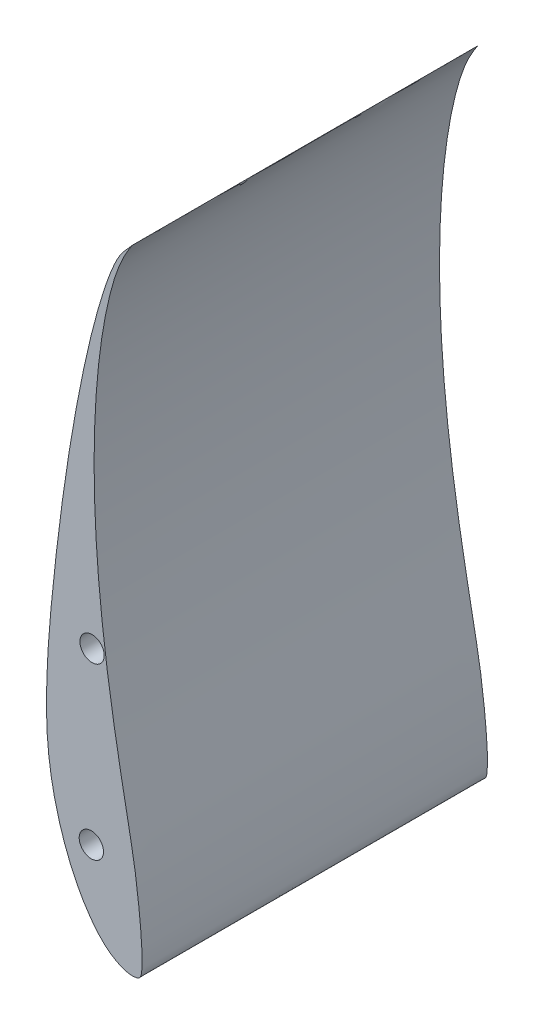
ISO-10303-21;
HEADER;
FILE_DESCRIPTION(('STEP AP214'),'2;1');
FILE_NAME('part.step','',(''),(''),'','','');
FILE_SCHEMA(('AUTOMOTIVE_DESIGN { 1 0 10303 214 1 1 1 1 }'));
ENDSEC;
DATA;
#1=APPLICATION_CONTEXT('core data for automotive mechanical design processes');
#2=APPLICATION_PROTOCOL_DEFINITION('international standard','automotive_design',2000,#1);
#3=PRODUCT_CONTEXT('',#1,'mechanical');
#4=PRODUCT('Part','Part','',(#3));
#5=PRODUCT_RELATED_PRODUCT_CATEGORY('part','',(#4));
#6=PRODUCT_DEFINITION_FORMATION('','',#4);
#7=PRODUCT_DEFINITION_CONTEXT('part definition',#1,'design');
#8=PRODUCT_DEFINITION('design','',#6,#7);
#9=PRODUCT_DEFINITION_SHAPE('','',#8);
#10=(LENGTH_UNIT() NAMED_UNIT(*) SI_UNIT(.MILLI.,.METRE.));
#11=(NAMED_UNIT(*) PLANE_ANGLE_UNIT() SI_UNIT($,.RADIAN.));
#12=(NAMED_UNIT(*) SI_UNIT($,.STERADIAN.) SOLID_ANGLE_UNIT());
#13=UNCERTAINTY_MEASURE_WITH_UNIT(LENGTH_MEASURE(1.E-05),#10,'distance_accuracy_value','');
#14=(GEOMETRIC_REPRESENTATION_CONTEXT(3) GLOBAL_UNCERTAINTY_ASSIGNED_CONTEXT((#13)) GLOBAL_UNIT_ASSIGNED_CONTEXT((#10,
#11,#12)) REPRESENTATION_CONTEXT('',''));
#15=CARTESIAN_POINT('',(0.,0.,0.));
#16=DIRECTION('',(0.,0.,1.));
#17=DIRECTION('',(1.,0.,0.));
#18=AXIS2_PLACEMENT_3D('',#15,#16,#17);
#19=CARTESIAN_POINT('',(-4.86581020899988,-143.632115137044,142.));
#20=DIRECTION('',(0.,0.,-1.));
#21=DIRECTION('',(-1.,0.,0.));
#22=AXIS2_PLACEMENT_3D('',#19,#20,#21);
#23=PLANE('',#22);
#24=CARTESIAN_POINT('',(0.819865796966968,114.81365286684,142.));
#25=CARTESIAN_POINT('',(0.813246926183125,114.815209385965,142.));
#26=CARTESIAN_POINT('',(0.176425634219394,113.960493852161,142.));
#27=CARTESIAN_POINT('',(-0.532817508495342,113.237641744467,142.));
#28=CARTESIAN_POINT('',(-2.01421148349499,111.632618069673,142.));
#29=CARTESIAN_POINT('',(-3.59013140463707,109.739065396254,142.));
#30=CARTESIAN_POINT('',(-5.17883402853494,107.148847981461,142.));
#31=CARTESIAN_POINT('',(-6.71846647439072,103.927892938628,142.));
#32=CARTESIAN_POINT('',(-8.32525941760967,100.039442167165,142.));
#33=CARTESIAN_POINT('',(-9.97683975458928,95.4894228075154,142.));
#34=CARTESIAN_POINT('',(-11.6615402964485,90.2990620585017,142.));
#35=CARTESIAN_POINT('',(-13.3647338269851,84.4953048938121,142.));
#36=CARTESIAN_POINT('',(-15.0784263738665,78.1106507356974,142.));
#37=CARTESIAN_POINT('',(-16.7868829663853,71.1803528853922,142.));
#38=CARTESIAN_POINT('',(-18.4777361691371,63.7441445491555,142.));
#39=CARTESIAN_POINT('',(-20.1404249243389,55.84634736181,142.));
#40=CARTESIAN_POINT('',(-21.766401741173,47.5351889362472,142.));
#41=CARTESIAN_POINT('',(-23.3356580151526,38.8592442617729,142.));
#42=CARTESIAN_POINT('',(-24.8459517285398,29.8731473932141,142.));
#43=CARTESIAN_POINT('',(-26.2778349462149,20.6286859228304,142.));
#44=CARTESIAN_POINT('',(-27.6341037003298,11.1856440223286,142.));
#45=CARTESIAN_POINT('',(-28.9040102375414,1.60454031838597,142.));
#46=CARTESIAN_POINT('',(-30.0834909264678,-8.04522921051284,142.));
#47=CARTESIAN_POINT('',(-31.1808971298618,-17.6865219764258,142.));
#48=CARTESIAN_POINT('',(-32.1685384546816,-27.2395224349034,142.));
#49=CARTESIAN_POINT('',(-33.027930070839,-36.6264037539548,142.));
#50=CARTESIAN_POINT('',(-33.7107007245241,-45.7811462822727,142.));
#51=CARTESIAN_POINT('',(-34.1803593040362,-54.6514547690725,142.));
#52=CARTESIAN_POINT('',(-34.3831797616097,-63.1879807888274,142.));
#53=CARTESIAN_POINT('',(-34.3615908489868,-71.3469929325134,142.));
#54=CARTESIAN_POINT('',(-33.9621017589121,-79.1132714862504,142.));
#55=CARTESIAN_POINT('',(-33.1525551141018,-86.4898248940389,142.));
#56=CARTESIAN_POINT('',(-32.0078441531027,-93.5066814545271,142.));
#57=CARTESIAN_POINT('',(-30.5248812085779,-100.16553469222,142.));
#58=CARTESIAN_POINT('',(-28.7859002935976,-106.459543606549,142.));
#59=CARTESIAN_POINT('',(-26.8217014226792,-112.362077468132,142.));
#60=CARTESIAN_POINT('',(-24.6782174571079,-117.848033344778,142.));
#61=CARTESIAN_POINT('',(-22.3669323965207,-122.883320864141,142.));
#62=CARTESIAN_POINT('',(-19.9347719767477,-127.451792098382,142.));
#63=CARTESIAN_POINT('',(-17.4093945600127,-131.528593062932,142.));
#64=CARTESIAN_POINT('',(-14.8250212006319,-135.088157717508,142.));
#65=CARTESIAN_POINT('',(-12.2364308195893,-138.12901738917,142.));
#66=CARTESIAN_POINT('',(-9.61536700755961,-140.607074269918,142.));
#67=CARTESIAN_POINT('',(-6.98452823345291,-142.510538035517,142.));
#68=CARTESIAN_POINT('',(-4.42507246945964,-143.916578778549,142.));
#69=CARTESIAN_POINT('',(-1.99499048453516,-144.817702096015,142.));
#70=CARTESIAN_POINT('',(0.247974452482689,-145.247087400469,142.));
#71=CARTESIAN_POINT('',(2.1449911469074,-145.16420441623,142.));
#72=CARTESIAN_POINT('',(3.88486113286132,-144.675810071662,142.));
#73=CARTESIAN_POINT('',(4.74854533987762,-142.860370088483,142.));
#74=CARTESIAN_POINT('',(4.86971751404793,-140.419487193154,142.));
#75=CARTESIAN_POINT('',(4.98715806179056,-137.080368492626,142.));
#76=CARTESIAN_POINT('',(4.80608071372348,-132.881191066442,142.));
#77=CARTESIAN_POINT('',(4.47331573074001,-127.869413914362,142.));
#78=CARTESIAN_POINT('',(3.94029838659758,-122.100812884567,142.));
#79=CARTESIAN_POINT('',(3.21910300241018,-115.634416751527,142.));
#80=CARTESIAN_POINT('',(2.29425402622951,-108.501757361903,142.));
#81=CARTESIAN_POINT('',(1.00163996884256,-100.706320341112,142.));
#82=CARTESIAN_POINT('',(-0.619277106262847,-92.2101503750795,142.));
#83=CARTESIAN_POINT('',(-2.38335213265747,-82.9707723329681,142.));
#84=CARTESIAN_POINT('',(-4.24596245124815,-73.0333475407801,142.));
#85=CARTESIAN_POINT('',(-6.12979705317527,-62.4602934776846,142.));
#86=CARTESIAN_POINT('',(-7.96415783513913,-51.3292590311406,142.));
#87=CARTESIAN_POINT('',(-9.68779069043856,-39.7265995398161,142.));
#88=CARTESIAN_POINT('',(-11.2374665660372,-27.752306188288,142.));
#89=CARTESIAN_POINT('',(-12.5680626398403,-15.5140604435323,142.));
#90=CARTESIAN_POINT('',(-13.619844048493,-3.12746839540878,142.));
#91=CARTESIAN_POINT('',(-14.3654273769826,9.28316745228069,142.));
#92=CARTESIAN_POINT('',(-14.7753158305868,21.5881878126068,142.));
#93=CARTESIAN_POINT('',(-14.8270876791483,33.654104807749,142.));
#94=CARTESIAN_POINT('',(-14.517225267258,45.3463042362449,142.));
#95=CARTESIAN_POINT('',(-13.8529825343594,56.53090348807,142.));
#96=CARTESIAN_POINT('',(-12.8429300004301,67.0734093408786,142.));
#97=CARTESIAN_POINT('',(-11.525838418391,76.8483069502315,142.));
#98=CARTESIAN_POINT('',(-9.93992482143754,85.7283302794104,142.));
#99=CARTESIAN_POINT('',(-8.13830342127941,93.6093649869733,142.));
#100=CARTESIAN_POINT('',(-6.21048826097844,100.346167223362,142.));
#101=CARTESIAN_POINT('',(-4.15295749300004,105.85954509139,142.));
#102=CARTESIAN_POINT('',(-2.27005342416922,109.793198277862,142.));
#103=CARTESIAN_POINT('',(-0.529057076719117,112.693375760594,142.));
#104=CARTESIAN_POINT('',(0.144679789540386,113.807499237532,142.));
#105=CARTESIAN_POINT('',(0.826619228795433,114.812064703823,142.));
#106=CARTESIAN_POINT('',(0.819865796966968,114.81365286684,142.));
#107=B_SPLINE_CURVE_WITH_KNOTS('',3,(#24,#25,#26,#27,#28,#29,#30,#31,#32,#33,#34,#35,#36,#37,
#38,#39,#40,#41,#42,#43,#44,#45,#46,#47,#48,#49,#50,#51,#52,#53,#54,#55,#56,#57,#58,#59,#60,#61,
#62,#63,#64,#65,#66,#67,#68,#69,#70,#71,#72,#73,#74,#75,#76,#77,#78,#79,#80,#81,#82,#83,#84,#85,
#86,#87,#88,#89,#90,#91,#92,#93,#94,#95,#96,#97,#98,#99,#100,#101,#102,#103,#104,#105,#106),
.UNSPECIFIED.,.T.,.F.,(4,1,1,1,1,1,1,1,1,1,1,1,1,1,1,1,1,1,1,1,1,1,1,1,1,1,1,1,1,1,1,1,1,1,1,1,
1,1,1,1,1,1,1,1,1,1,1,1,1,1,1,1,1,1,1,1,1,1,1,1,1,1,1,1,1,1,1,1,1,1,1,1,1,1,1,1,1,1,1,1,4),(0.,
0.000979677557134172,0.00364886216776309,0.0074834985194781,0.0120952771855933,
0.0175255907768788,0.0240517799938711,0.0317830505527587,0.0406778280832618,0.050710300790478,
0.0618332290621795,0.0739892504845854,0.0871181731906812,0.101145048769791,0.115990637111827,
0.131570421640589,0.147788379302961,0.164550916882416,0.181757895150531,0.199311954944345,
0.217095071712264,0.234990228463986,0.252856883122009,0.270540593729572,0.287886779266045,
0.304773437599674,0.321101419214061,0.336806063174811,0.351800032584037,0.366031063392082,
0.379615674919835,0.392652962879186,0.405170358707495,0.417171919049936,0.428603516911185,
0.43941895910826,0.449596586064162,0.459102079103161,0.467907877534646,0.475988300736527,
0.483308968746149,0.489874507816402,0.495803249719208,0.501149411695553,0.50590307325604,
0.510046768536663,0.513579310681042,0.516446926626751,0.5193500525909,0.523823355179486,
0.529973793997694,0.537715654387927,0.546967844488146,0.55763736682571,0.569620481096633,
0.582804124215616,0.597246960791632,0.613135036654701,0.630443600329816,0.649056123608545,
0.668822256795696,0.689594964002684,0.711189650864602,0.733426688964389,0.756094117504156,
0.778988553684861,0.801889682684954,0.824566597829707,0.846792284880411,0.868338290507787,
0.888978162959066,0.908492011340558,0.926658767581932,0.943286193042322,0.958169210358794,
0.971135821634751,0.981955623079976,0.990251791025976,0.995852565249962,0.999000405686701,1.),.UNSPECIFIED.);
#108=CARTESIAN_POINT('',(0.819865796966968,114.81365286684,142.));
#109=VERTEX_POINT('',#108);
#110=EDGE_CURVE('E10',#109,#109,#107,.T.);
#111=ORIENTED_EDGE('',*,*,#110,.T.);
#112=EDGE_LOOP('',(#111));
#113=FACE_BOUND('',#112,.T.);
#114=CARTESIAN_POINT('',(-15.9210004795535,-106.954454188191,142.));
#115=DIRECTION('',(0.,0.,1.));
#116=DIRECTION('',(1.,0.,0.));
#117=AXIS2_PLACEMENT_3D('',#114,#115,#116);
#118=CIRCLE('',#117,5.00000000000773);
#119=CARTESIAN_POINT('',(-10.9210004795457,-106.954454188191,142.));
#120=VERTEX_POINT('',#119);
#121=EDGE_CURVE('E54',#120,#120,#118,.T.);
#122=ORIENTED_EDGE('',*,*,#121,.F.);
#123=EDGE_LOOP('',(#122));
#124=FACE_BOUND('',#123,.T.);
#125=CARTESIAN_POINT('',(-15.6291410385062,-36.9544541881914,142.));
#126=DIRECTION('',(0.,0.,1.));
#127=DIRECTION('',(1.,0.,0.));
#128=AXIS2_PLACEMENT_3D('',#125,#126,#127);
#129=CIRCLE('',#128,5.00000000000774);
#130=CARTESIAN_POINT('',(-10.6291410384985,-36.9544541881914,142.));
#131=VERTEX_POINT('',#130);
#132=EDGE_CURVE('E66',#131,#131,#129,.T.);
#133=ORIENTED_EDGE('',*,*,#132,.F.);
#134=EDGE_LOOP('',(#133));
#135=FACE_BOUND('',#134,.T.);
#136=ADVANCED_FACE('F39',(#113,#124,#135),#23,.F.);
#137=CARTESIAN_POINT('',(-4.86581020899988,-143.632115137044,0.));
#138=DIRECTION('',(0.,0.,-1.));
#139=DIRECTION('',(-1.,0.,0.));
#140=AXIS2_PLACEMENT_3D('',#137,#138,#139);
#141=PLANE('',#140);
#142=CARTESIAN_POINT('',(-15.9210004795535,-106.954454188191,0.));
#143=DIRECTION('',(0.,0.,1.));
#144=DIRECTION('',(1.,0.,0.));
#145=AXIS2_PLACEMENT_3D('',#142,#143,#144);
#146=CIRCLE('',#145,5.00000000000773);
#147=CARTESIAN_POINT('',(-10.9210004795457,-106.954454188191,0.));
#148=VERTEX_POINT('',#147);
#149=EDGE_CURVE('E59',#148,#148,#146,.T.);
#150=ORIENTED_EDGE('',*,*,#149,.T.);
#151=EDGE_LOOP('',(#150));
#152=FACE_BOUND('',#151,.T.);
#153=CARTESIAN_POINT('',(0.819865796966968,114.81365286684,0.));
#154=CARTESIAN_POINT('',(0.813246926183125,114.815209385965,0.));
#155=CARTESIAN_POINT('',(0.176425634219394,113.960493852161,0.));
#156=CARTESIAN_POINT('',(-0.532817508495342,113.237641744467,0.));
#157=CARTESIAN_POINT('',(-2.01421148349499,111.632618069673,0.));
#158=CARTESIAN_POINT('',(-3.59013140463707,109.739065396254,0.));
#159=CARTESIAN_POINT('',(-5.17883402853494,107.148847981461,0.));
#160=CARTESIAN_POINT('',(-6.71846647439072,103.927892938628,0.));
#161=CARTESIAN_POINT('',(-8.32525941760967,100.039442167165,0.));
#162=CARTESIAN_POINT('',(-9.97683975458928,95.4894228075154,0.));
#163=CARTESIAN_POINT('',(-11.6615402964485,90.2990620585017,0.));
#164=CARTESIAN_POINT('',(-13.3647338269851,84.4953048938121,0.));
#165=CARTESIAN_POINT('',(-15.0784263738665,78.1106507356974,0.));
#166=CARTESIAN_POINT('',(-16.7868829663853,71.1803528853922,0.));
#167=CARTESIAN_POINT('',(-18.4777361691371,63.7441445491555,0.));
#168=CARTESIAN_POINT('',(-20.1404249243389,55.84634736181,0.));
#169=CARTESIAN_POINT('',(-21.766401741173,47.5351889362472,0.));
#170=CARTESIAN_POINT('',(-23.3356580151526,38.8592442617729,0.));
#171=CARTESIAN_POINT('',(-24.8459517285398,29.8731473932141,0.));
#172=CARTESIAN_POINT('',(-26.2778349462149,20.6286859228304,0.));
#173=CARTESIAN_POINT('',(-27.6341037003298,11.1856440223286,0.));
#174=CARTESIAN_POINT('',(-28.9040102375414,1.60454031838597,0.));
#175=CARTESIAN_POINT('',(-30.0834909264678,-8.04522921051284,0.));
#176=CARTESIAN_POINT('',(-31.1808971298618,-17.6865219764258,0.));
#177=CARTESIAN_POINT('',(-32.1685384546816,-27.2395224349034,0.));
#178=CARTESIAN_POINT('',(-33.027930070839,-36.6264037539548,0.));
#179=CARTESIAN_POINT('',(-33.7107007245241,-45.7811462822727,0.));
#180=CARTESIAN_POINT('',(-34.1803593040362,-54.6514547690725,0.));
#181=CARTESIAN_POINT('',(-34.3831797616097,-63.1879807888274,0.));
#182=CARTESIAN_POINT('',(-34.3615908489868,-71.3469929325134,0.));
#183=CARTESIAN_POINT('',(-33.9621017589121,-79.1132714862504,0.));
#184=CARTESIAN_POINT('',(-33.1525551141018,-86.4898248940389,0.));
#185=CARTESIAN_POINT('',(-32.0078441531027,-93.5066814545271,0.));
#186=CARTESIAN_POINT('',(-30.5248812085779,-100.16553469222,0.));
#187=CARTESIAN_POINT('',(-28.7859002935976,-106.459543606549,0.));
#188=CARTESIAN_POINT('',(-26.8217014226792,-112.362077468132,0.));
#189=CARTESIAN_POINT('',(-24.6782174571079,-117.848033344778,0.));
#190=CARTESIAN_POINT('',(-22.3669323965207,-122.883320864141,0.));
#191=CARTESIAN_POINT('',(-19.9347719767477,-127.451792098382,0.));
#192=CARTESIAN_POINT('',(-17.4093945600127,-131.528593062932,0.));
#193=CARTESIAN_POINT('',(-14.8250212006319,-135.088157717508,0.));
#194=CARTESIAN_POINT('',(-12.2364308195893,-138.12901738917,0.));
#195=CARTESIAN_POINT('',(-9.61536700755961,-140.607074269918,0.));
#196=CARTESIAN_POINT('',(-6.98452823345291,-142.510538035517,0.));
#197=CARTESIAN_POINT('',(-4.42507246945964,-143.916578778549,0.));
#198=CARTESIAN_POINT('',(-1.99499048453516,-144.817702096015,0.));
#199=CARTESIAN_POINT('',(0.247974452482689,-145.247087400469,0.));
#200=CARTESIAN_POINT('',(2.1449911469074,-145.16420441623,0.));
#201=CARTESIAN_POINT('',(3.88486113286132,-144.675810071662,0.));
#202=CARTESIAN_POINT('',(4.74854533987762,-142.860370088483,0.));
#203=CARTESIAN_POINT('',(4.86971751404793,-140.419487193154,0.));
#204=CARTESIAN_POINT('',(4.98715806179056,-137.080368492626,0.));
#205=CARTESIAN_POINT('',(4.80608071372348,-132.881191066442,0.));
#206=CARTESIAN_POINT('',(4.47331573074001,-127.869413914362,0.));
#207=CARTESIAN_POINT('',(3.94029838659758,-122.100812884567,0.));
#208=CARTESIAN_POINT('',(3.21910300241018,-115.634416751527,0.));
#209=CARTESIAN_POINT('',(2.29425402622951,-108.501757361903,0.));
#210=CARTESIAN_POINT('',(1.00163996884256,-100.706320341112,0.));
#211=CARTESIAN_POINT('',(-0.619277106262847,-92.2101503750795,0.));
#212=CARTESIAN_POINT('',(-2.38335213265747,-82.9707723329681,0.));
#213=CARTESIAN_POINT('',(-4.24596245124815,-73.0333475407801,0.));
#214=CARTESIAN_POINT('',(-6.12979705317527,-62.4602934776846,0.));
#215=CARTESIAN_POINT('',(-7.96415783513913,-51.3292590311406,0.));
#216=CARTESIAN_POINT('',(-9.68779069043856,-39.7265995398161,0.));
#217=CARTESIAN_POINT('',(-11.2374665660372,-27.752306188288,0.));
#218=CARTESIAN_POINT('',(-12.5680626398403,-15.5140604435323,0.));
#219=CARTESIAN_POINT('',(-13.619844048493,-3.12746839540878,0.));
#220=CARTESIAN_POINT('',(-14.3654273769826,9.28316745228069,0.));
#221=CARTESIAN_POINT('',(-14.7753158305868,21.5881878126068,0.));
#222=CARTESIAN_POINT('',(-14.8270876791483,33.654104807749,0.));
#223=CARTESIAN_POINT('',(-14.517225267258,45.3463042362449,0.));
#224=CARTESIAN_POINT('',(-13.8529825343594,56.53090348807,0.));
#225=CARTESIAN_POINT('',(-12.8429300004301,67.0734093408786,0.));
#226=CARTESIAN_POINT('',(-11.525838418391,76.8483069502315,0.));
#227=CARTESIAN_POINT('',(-9.93992482143754,85.7283302794104,0.));
#228=CARTESIAN_POINT('',(-8.13830342127941,93.6093649869733,0.));
#229=CARTESIAN_POINT('',(-6.21048826097844,100.346167223362,0.));
#230=CARTESIAN_POINT('',(-4.15295749300004,105.85954509139,0.));
#231=CARTESIAN_POINT('',(-2.27005342416922,109.793198277862,0.));
#232=CARTESIAN_POINT('',(-0.529057076719117,112.693375760594,0.));
#233=CARTESIAN_POINT('',(0.144679789540386,113.807499237532,0.));
#234=CARTESIAN_POINT('',(0.826619228795433,114.812064703823,0.));
#235=CARTESIAN_POINT('',(0.819865796966968,114.81365286684,0.));
#236=B_SPLINE_CURVE_WITH_KNOTS('',3,(#153,#154,#155,#156,#157,#158,#159,#160,#161,#162,#163,
#164,#165,#166,#167,#168,#169,#170,#171,#172,#173,#174,#175,#176,#177,#178,#179,#180,#181,#182,
#183,#184,#185,#186,#187,#188,#189,#190,#191,#192,#193,#194,#195,#196,#197,#198,#199,#200,#201,
#202,#203,#204,#205,#206,#207,#208,#209,#210,#211,#212,#213,#214,#215,#216,#217,#218,#219,#220,
#221,#222,#223,#224,#225,#226,#227,#228,#229,#230,#231,#232,#233,#234,#235),.UNSPECIFIED.,.T.,
.F.,(4,1,1,1,1,1,1,1,1,1,1,1,1,1,1,1,1,1,1,1,1,1,1,1,1,1,1,1,1,1,1,1,1,1,1,1,1,1,1,1,1,1,1,1,1,
1,1,1,1,1,1,1,1,1,1,1,1,1,1,1,1,1,1,1,1,1,1,1,1,1,1,1,1,1,1,1,1,1,1,1,4),(0.,
0.000979677557134172,0.00364886216776309,0.0074834985194781,0.0120952771855933,
0.0175255907768788,0.0240517799938711,0.0317830505527587,0.0406778280832618,0.050710300790478,
0.0618332290621795,0.0739892504845854,0.0871181731906812,0.101145048769791,0.115990637111827,
0.131570421640589,0.147788379302961,0.164550916882416,0.181757895150531,0.199311954944345,
0.217095071712264,0.234990228463986,0.252856883122009,0.270540593729572,0.287886779266045,
0.304773437599674,0.321101419214061,0.336806063174811,0.351800032584037,0.366031063392082,
0.379615674919835,0.392652962879186,0.405170358707495,0.417171919049936,0.428603516911185,
0.43941895910826,0.449596586064162,0.459102079103161,0.467907877534646,0.475988300736527,
0.483308968746149,0.489874507816402,0.495803249719208,0.501149411695553,0.50590307325604,
0.510046768536663,0.513579310681042,0.516446926626751,0.5193500525909,0.523823355179486,
0.529973793997694,0.537715654387927,0.546967844488146,0.55763736682571,0.569620481096633,
0.582804124215616,0.597246960791632,0.613135036654701,0.630443600329816,0.649056123608545,
0.668822256795696,0.689594964002684,0.711189650864602,0.733426688964389,0.756094117504156,
0.778988553684861,0.801889682684954,0.824566597829707,0.846792284880411,0.868338290507787,
0.888978162959066,0.908492011340558,0.926658767581932,0.943286193042322,0.958169210358794,
0.971135821634751,0.981955623079976,0.990251791025976,0.995852565249962,0.999000405686701,1.),.UNSPECIFIED.);
#237=CARTESIAN_POINT('',(0.819865796966968,114.81365286684,0.));
#238=VERTEX_POINT('',#237);
#239=EDGE_CURVE('E44',#238,#238,#236,.T.);
#240=ORIENTED_EDGE('',*,*,#239,.F.);
#241=EDGE_LOOP('',(#240));
#242=FACE_BOUND('',#241,.T.);
#243=CARTESIAN_POINT('',(-15.6291410385062,-36.9544541881914,0.));
#244=DIRECTION('',(0.,0.,1.));
#245=DIRECTION('',(1.,0.,0.));
#246=AXIS2_PLACEMENT_3D('',#243,#244,#245);
#247=CIRCLE('',#246,5.00000000000774);
#248=CARTESIAN_POINT('',(-10.6291410384985,-36.9544541881914,0.));
#249=VERTEX_POINT('',#248);
#250=EDGE_CURVE('E70',#249,#249,#247,.T.);
#251=ORIENTED_EDGE('',*,*,#250,.T.);
#252=EDGE_LOOP('',(#251));
#253=FACE_BOUND('',#252,.T.);
#254=ADVANCED_FACE('F82',(#152,#242,#253),#141,.T.);
#255=DIRECTION('',(0.,0.,-1.));
#256=VECTOR('',#255,1.);
#257=SURFACE_OF_LINEAR_EXTRUSION('',#107,#256);
#258=ORIENTED_EDGE('',*,*,#110,.F.);
#259=EDGE_LOOP('',(#258));
#260=FACE_BOUND('',#259,.T.);
#261=ORIENTED_EDGE('',*,*,#239,.T.);
#262=EDGE_LOOP('',(#261));
#263=FACE_BOUND('',#262,.T.);
#264=ADVANCED_FACE('F41',(#260,#263),#257,.F.);
#265=CARTESIAN_POINT('',(-15.9210004795535,-106.954454188191,142.));
#266=DIRECTION('',(0.,0.,-1.));
#267=DIRECTION('',(-1.,0.,0.));
#268=AXIS2_PLACEMENT_3D('',#265,#266,#267);
#269=CYLINDRICAL_SURFACE('',#268,5.00000000000773);
#270=ORIENTED_EDGE('',*,*,#121,.T.);
#271=EDGE_LOOP('',(#270));
#272=FACE_BOUND('',#271,.T.);
#273=ORIENTED_EDGE('',*,*,#149,.F.);
#274=EDGE_LOOP('',(#273));
#275=FACE_BOUND('',#274,.T.);
#276=ADVANCED_FACE('F90',(#272,#275),#269,.F.);
#277=CARTESIAN_POINT('',(-15.6291410385062,-36.9544541881914,142.));
#278=DIRECTION('',(0.,0.,-1.));
#279=DIRECTION('',(-1.,0.,0.));
#280=AXIS2_PLACEMENT_3D('',#277,#278,#279);
#281=CYLINDRICAL_SURFACE('',#280,5.00000000000774);
#282=ORIENTED_EDGE('',*,*,#132,.T.);
#283=EDGE_LOOP('',(#282));
#284=FACE_BOUND('',#283,.T.);
#285=ORIENTED_EDGE('',*,*,#250,.F.);
#286=EDGE_LOOP('',(#285));
#287=FACE_BOUND('',#286,.T.);
#288=ADVANCED_FACE('F78',(#284,#287),#281,.F.);
#289=CLOSED_SHELL('',(#136,#254,#264,#276,#288));
#290=MANIFOLD_SOLID_BREP('B2',#289);
#291=ADVANCED_BREP_SHAPE_REPRESENTATION('',(#18,#290),#14);
#292=SHAPE_DEFINITION_REPRESENTATION(#9,#291);
ENDSEC;
END-ISO-10303-21;
